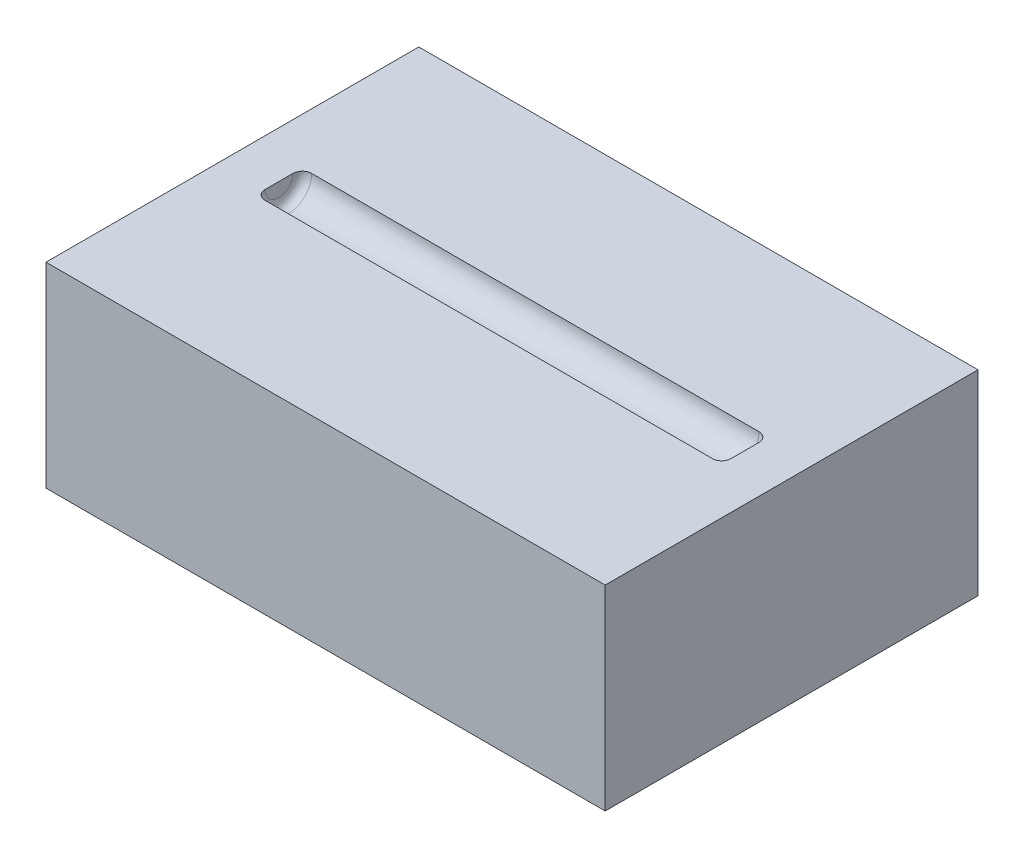
ISO-10303-21;
HEADER;
FILE_DESCRIPTION(('STEP AP214'),'2;1');
FILE_NAME('part.step','',(''),(''),'','','');
FILE_SCHEMA(('AUTOMOTIVE_DESIGN { 1 0 10303 214 1 1 1 1 }'));
ENDSEC;
DATA;
#1=APPLICATION_CONTEXT('core data for automotive mechanical design processes');
#2=APPLICATION_PROTOCOL_DEFINITION('international standard','automotive_design',2000,#1);
#3=PRODUCT_CONTEXT('',#1,'mechanical');
#4=PRODUCT('Part','Part','',(#3));
#5=PRODUCT_RELATED_PRODUCT_CATEGORY('part','',(#4));
#6=PRODUCT_DEFINITION_FORMATION('','',#4);
#7=PRODUCT_DEFINITION_CONTEXT('part definition',#1,'design');
#8=PRODUCT_DEFINITION('design','',#6,#7);
#9=PRODUCT_DEFINITION_SHAPE('','',#8);
#10=(LENGTH_UNIT() NAMED_UNIT(*) SI_UNIT(.MILLI.,.METRE.));
#11=(NAMED_UNIT(*) PLANE_ANGLE_UNIT() SI_UNIT($,.RADIAN.));
#12=(NAMED_UNIT(*) SI_UNIT($,.STERADIAN.) SOLID_ANGLE_UNIT());
#13=UNCERTAINTY_MEASURE_WITH_UNIT(LENGTH_MEASURE(1.E-05),#10,'distance_accuracy_value','');
#14=(GEOMETRIC_REPRESENTATION_CONTEXT(3) GLOBAL_UNCERTAINTY_ASSIGNED_CONTEXT((#13)) GLOBAL_UNIT_ASSIGNED_CONTEXT((#10,
#11,#12)) REPRESENTATION_CONTEXT('',''));
#15=CARTESIAN_POINT('',(0.,0.,0.));
#16=DIRECTION('',(0.,0.,1.));
#17=DIRECTION('',(1.,0.,0.));
#18=AXIS2_PLACEMENT_3D('',#15,#16,#17);
#19=CARTESIAN_POINT('',(76.2,-53.34,50.8));
#20=DIRECTION('',(1.,0.,0.));
#21=DIRECTION('',(0.,0.,-1.));
#22=AXIS2_PLACEMENT_3D('',#19,#20,#21);
#23=PLANE('',#22);
#24=DIRECTION('',(0.,0.,-1.));
#25=VECTOR('',#24,1.);
#26=CARTESIAN_POINT('',(76.2,0.,50.8));
#27=LINE('',#26,#25);
#28=CARTESIAN_POINT('',(76.2,0.,50.8));
#29=VERTEX_POINT('',#28);
#30=CARTESIAN_POINT('',(76.2,0.,-50.8));
#31=VERTEX_POINT('',#30);
#32=EDGE_CURVE('E132',#29,#31,#27,.T.);
#33=ORIENTED_EDGE('',*,*,#32,.F.);
#34=DIRECTION('',(0.,1.,0.));
#35=VECTOR('',#34,1.);
#36=CARTESIAN_POINT('',(76.2,-53.34,50.8));
#37=LINE('',#36,#35);
#38=CARTESIAN_POINT('',(76.2,-53.34,50.8));
#39=VERTEX_POINT('',#38);
#40=EDGE_CURVE('E123',#39,#29,#37,.T.);
#41=ORIENTED_EDGE('',*,*,#40,.F.);
#42=DIRECTION('',(0.,0.,-1.));
#43=VECTOR('',#42,1.);
#44=CARTESIAN_POINT('',(76.2,-53.34,50.8));
#45=LINE('',#44,#43);
#46=CARTESIAN_POINT('',(76.2,-53.34,-50.8));
#47=VERTEX_POINT('',#46);
#48=EDGE_CURVE('E118',#39,#47,#45,.T.);
#49=ORIENTED_EDGE('',*,*,#48,.T.);
#50=DIRECTION('',(0.,1.,0.));
#51=VECTOR('',#50,1.);
#52=CARTESIAN_POINT('',(76.2,-53.34,-50.8));
#53=LINE('',#52,#51);
#54=EDGE_CURVE('E100',#47,#31,#53,.T.);
#55=ORIENTED_EDGE('',*,*,#54,.T.);
#56=EDGE_LOOP('',(#33,#41,#49,#55));
#57=FACE_BOUND('',#56,.T.);
#58=ADVANCED_FACE('F35',(#57),#23,.T.);
#59=CARTESIAN_POINT('',(-76.2,-53.34,50.8));
#60=DIRECTION('',(0.,0.,1.));
#61=DIRECTION('',(1.,0.,0.));
#62=AXIS2_PLACEMENT_3D('',#59,#60,#61);
#63=PLANE('',#62);
#64=DIRECTION('',(1.,0.,0.));
#65=VECTOR('',#64,1.);
#66=CARTESIAN_POINT('',(-76.2,0.,50.8));
#67=LINE('',#66,#65);
#68=CARTESIAN_POINT('',(-76.2,0.,50.8));
#69=VERTEX_POINT('',#68);
#70=EDGE_CURVE('E124',#69,#29,#67,.T.);
#71=ORIENTED_EDGE('',*,*,#70,.F.);
#72=DIRECTION('',(0.,1.,0.));
#73=VECTOR('',#72,1.);
#74=CARTESIAN_POINT('',(-76.2,-53.34,50.8));
#75=LINE('',#74,#73);
#76=CARTESIAN_POINT('',(-76.2,-53.34,50.8));
#77=VERTEX_POINT('',#76);
#78=EDGE_CURVE('E139',#77,#69,#75,.T.);
#79=ORIENTED_EDGE('',*,*,#78,.F.);
#80=DIRECTION('',(1.,0.,0.));
#81=VECTOR('',#80,1.);
#82=CARTESIAN_POINT('',(-76.2,-53.34,50.8));
#83=LINE('',#82,#81);
#84=EDGE_CURVE('E111',#77,#39,#83,.T.);
#85=ORIENTED_EDGE('',*,*,#84,.T.);
#86=ORIENTED_EDGE('',*,*,#40,.T.);
#87=EDGE_LOOP('',(#71,#79,#85,#86));
#88=FACE_BOUND('',#87,.T.);
#89=ADVANCED_FACE('F185',(#88),#63,.T.);
#90=CARTESIAN_POINT('',(-76.2,-53.34,50.8));
#91=DIRECTION('',(-1.,0.,0.));
#92=DIRECTION('',(0.,0.,1.));
#93=AXIS2_PLACEMENT_3D('',#90,#91,#92);
#94=PLANE('',#93);
#95=DIRECTION('',(0.,0.,1.));
#96=VECTOR('',#95,1.);
#97=CARTESIAN_POINT('',(-76.2,0.,50.8));
#98=LINE('',#97,#96);
#99=CARTESIAN_POINT('',(-76.2,0.,-50.8));
#100=VERTEX_POINT('',#99);
#101=EDGE_CURVE('E127',#100,#69,#98,.T.);
#102=ORIENTED_EDGE('',*,*,#101,.F.);
#103=DIRECTION('',(0.,1.,0.));
#104=VECTOR('',#103,1.);
#105=CARTESIAN_POINT('',(-76.2,-53.34,-50.8));
#106=LINE('',#105,#104);
#107=CARTESIAN_POINT('',(-76.2,-53.34,-50.8));
#108=VERTEX_POINT('',#107);
#109=EDGE_CURVE('E110',#108,#100,#106,.T.);
#110=ORIENTED_EDGE('',*,*,#109,.F.);
#111=DIRECTION('',(0.,0.,1.));
#112=VECTOR('',#111,1.);
#113=CARTESIAN_POINT('',(-76.2,-53.34,50.8));
#114=LINE('',#113,#112);
#115=EDGE_CURVE('E121',#108,#77,#114,.T.);
#116=ORIENTED_EDGE('',*,*,#115,.T.);
#117=ORIENTED_EDGE('',*,*,#78,.T.);
#118=EDGE_LOOP('',(#102,#110,#116,#117));
#119=FACE_BOUND('',#118,.T.);
#120=ADVANCED_FACE('F190',(#119),#94,.T.);
#121=CARTESIAN_POINT('',(-76.2,-53.34,-50.8));
#122=DIRECTION('',(0.,0.,-1.));
#123=DIRECTION('',(-1.,0.,0.));
#124=AXIS2_PLACEMENT_3D('',#121,#122,#123);
#125=PLANE('',#124);
#126=DIRECTION('',(-1.,0.,0.));
#127=VECTOR('',#126,1.);
#128=CARTESIAN_POINT('',(-76.2,0.,-50.8));
#129=LINE('',#128,#127);
#130=EDGE_CURVE('E105',#31,#100,#129,.T.);
#131=ORIENTED_EDGE('',*,*,#130,.F.);
#132=ORIENTED_EDGE('',*,*,#54,.F.);
#133=DIRECTION('',(-1.,0.,0.));
#134=VECTOR('',#133,1.);
#135=CARTESIAN_POINT('',(-76.2,-53.34,-50.8));
#136=LINE('',#135,#134);
#137=EDGE_CURVE('E103',#47,#108,#136,.T.);
#138=ORIENTED_EDGE('',*,*,#137,.T.);
#139=ORIENTED_EDGE('',*,*,#109,.T.);
#140=EDGE_LOOP('',(#131,#132,#138,#139));
#141=FACE_BOUND('',#140,.T.);
#142=ADVANCED_FACE('F102',(#141),#125,.T.);
#143=CARTESIAN_POINT('',(0.,-53.34,0.));
#144=DIRECTION('',(0.,-1.,0.));
#145=DIRECTION('',(0.,0.,-1.));
#146=AXIS2_PLACEMENT_3D('',#143,#144,#145);
#147=PLANE('',#146);
#148=ORIENTED_EDGE('',*,*,#48,.F.);
#149=ORIENTED_EDGE('',*,*,#84,.F.);
#150=ORIENTED_EDGE('',*,*,#115,.F.);
#151=ORIENTED_EDGE('',*,*,#137,.F.);
#152=EDGE_LOOP('',(#148,#149,#150,#151));
#153=FACE_BOUND('',#152,.T.);
#154=ADVANCED_FACE('F116',(#153),#147,.T.);
#155=CARTESIAN_POINT('',(0.,0.,0.));
#156=DIRECTION('',(0.,-1.,0.));
#157=DIRECTION('',(0.,0.,-1.));
#158=AXIS2_PLACEMENT_3D('',#155,#156,#157);
#159=PLANE('',#158);
#160=DIRECTION('',(1.,0.,0.));
#161=VECTOR('',#160,1.);
#162=CARTESIAN_POINT('',(-94.1605122421383,0.,6.35));
#163=LINE('',#162,#161);
#164=CARTESIAN_POINT('',(60.96,0.,6.35));
#165=VERTEX_POINT('',#164);
#166=CARTESIAN_POINT('',(-60.96,0.,6.35));
#167=VERTEX_POINT('',#166);
#168=EDGE_CURVE('E138',#165,#167,#163,.F.);
#169=ORIENTED_EDGE('',*,*,#168,.T.);
#170=CARTESIAN_POINT('',(-60.96,0.,3.81));
#171=DIRECTION('',(0.,-1.,0.));
#172=DIRECTION('',(0.,0.,-1.));
#173=AXIS2_PLACEMENT_3D('',#170,#171,#172);
#174=CIRCLE('',#173,2.54);
#175=CARTESIAN_POINT('',(-63.5,0.,3.81));
#176=VERTEX_POINT('',#175);
#177=EDGE_CURVE('E12',#167,#176,#174,.T.);
#178=ORIENTED_EDGE('',*,*,#177,.T.);
#179=DIRECTION('',(0.,0.,-1.));
#180=VECTOR('',#179,1.);
#181=CARTESIAN_POINT('',(-63.5,0.,0.));
#182=LINE('',#181,#180);
#183=CARTESIAN_POINT('',(-63.5,0.,-3.81));
#184=VERTEX_POINT('',#183);
#185=EDGE_CURVE('E146',#176,#184,#182,.T.);
#186=ORIENTED_EDGE('',*,*,#185,.T.);
#187=CARTESIAN_POINT('',(-60.96,0.,-3.81));
#188=DIRECTION('',(0.,-1.,0.));
#189=DIRECTION('',(0.,0.,-1.));
#190=AXIS2_PLACEMENT_3D('',#187,#188,#189);
#191=CIRCLE('',#190,2.54);
#192=CARTESIAN_POINT('',(-60.96,0.,-6.35));
#193=VERTEX_POINT('',#192);
#194=EDGE_CURVE('E43',#184,#193,#191,.T.);
#195=ORIENTED_EDGE('',*,*,#194,.T.);
#196=DIRECTION('',(1.,0.,0.));
#197=VECTOR('',#196,1.);
#198=CARTESIAN_POINT('',(-94.1605122421383,0.,-6.35));
#199=LINE('',#198,#197);
#200=CARTESIAN_POINT('',(60.96,0.,-6.35));
#201=VERTEX_POINT('',#200);
#202=EDGE_CURVE('E148',#193,#201,#199,.T.);
#203=ORIENTED_EDGE('',*,*,#202,.T.);
#204=CARTESIAN_POINT('',(60.96,0.,-3.81));
#205=DIRECTION('',(0.,-1.,0.));
#206=DIRECTION('',(0.,0.,-1.));
#207=AXIS2_PLACEMENT_3D('',#204,#205,#206);
#208=CIRCLE('',#207,2.54);
#209=CARTESIAN_POINT('',(63.5,0.,-3.81));
#210=VERTEX_POINT('',#209);
#211=EDGE_CURVE('E160',#201,#210,#208,.T.);
#212=ORIENTED_EDGE('',*,*,#211,.T.);
#213=DIRECTION('',(0.,0.,1.));
#214=VECTOR('',#213,1.);
#215=CARTESIAN_POINT('',(63.5,0.,0.));
#216=LINE('',#215,#214);
#217=CARTESIAN_POINT('',(63.5,0.,3.81));
#218=VERTEX_POINT('',#217);
#219=EDGE_CURVE('E143',#210,#218,#216,.T.);
#220=ORIENTED_EDGE('',*,*,#219,.T.);
#221=CARTESIAN_POINT('',(60.96,0.,3.81));
#222=DIRECTION('',(0.,-1.,0.));
#223=DIRECTION('',(0.,0.,-1.));
#224=AXIS2_PLACEMENT_3D('',#221,#222,#223);
#225=CIRCLE('',#224,2.54);
#226=EDGE_CURVE('E162',#218,#165,#225,.T.);
#227=ORIENTED_EDGE('',*,*,#226,.T.);
#228=EDGE_LOOP('',(#169,#178,#186,#195,#203,#212,#220,#227));
#229=FACE_BOUND('',#228,.T.);
#230=ORIENTED_EDGE('',*,*,#32,.T.);
#231=ORIENTED_EDGE('',*,*,#130,.T.);
#232=ORIENTED_EDGE('',*,*,#101,.T.);
#233=ORIENTED_EDGE('',*,*,#70,.T.);
#234=EDGE_LOOP('',(#230,#231,#232,#233));
#235=FACE_BOUND('',#234,.T.);
#236=ADVANCED_FACE('F164',(#229,#235),#159,.F.);
#237=CARTESIAN_POINT('',(-63.5,-53.34,50.8));
#238=DIRECTION('',(-1.,0.,0.));
#239=DIRECTION('',(0.,0.,1.));
#240=AXIS2_PLACEMENT_3D('',#237,#238,#239);
#241=PLANE('',#240);
#242=ORIENTED_EDGE('',*,*,#185,.F.);
#243=CARTESIAN_POINT('',(-63.5,0.,0.));
#244=DIRECTION('',(-1.,0.,0.));
#245=DIRECTION('',(0.,0.,1.));
#246=AXIS2_PLACEMENT_3D('',#243,#244,#245);
#247=CIRCLE('',#246,3.81);
#248=EDGE_CURVE('E158',#176,#184,#247,.F.);
#249=ORIENTED_EDGE('',*,*,#248,.T.);
#250=EDGE_LOOP('',(#242,#249));
#251=FACE_BOUND('',#250,.T.);
#252=ADVANCED_FACE('F171',(#251),#241,.F.);
#253=CARTESIAN_POINT('',(63.5,0.,0.));
#254=DIRECTION('',(1.,0.,0.));
#255=DIRECTION('',(0.,0.,-1.));
#256=AXIS2_PLACEMENT_3D('',#253,#254,#255);
#257=PLANE('',#256);
#258=ORIENTED_EDGE('',*,*,#219,.F.);
#259=CARTESIAN_POINT('',(63.5,0.,0.));
#260=DIRECTION('',(1.,0.,0.));
#261=DIRECTION('',(0.,0.,-1.));
#262=AXIS2_PLACEMENT_3D('',#259,#260,#261);
#263=CIRCLE('',#262,3.81);
#264=EDGE_CURVE('E156',#210,#218,#263,.F.);
#265=ORIENTED_EDGE('',*,*,#264,.T.);
#266=EDGE_LOOP('',(#258,#265));
#267=FACE_BOUND('',#266,.T.);
#268=ADVANCED_FACE('F173',(#267),#257,.F.);
#269=CARTESIAN_POINT('',(-94.1605122421383,0.,0.));
#270=DIRECTION('',(1.,0.,0.));
#271=DIRECTION('',(0.,0.,-1.));
#272=AXIS2_PLACEMENT_3D('',#269,#270,#271);
#273=CYLINDRICAL_SURFACE('',#272,6.35);
#274=ORIENTED_EDGE('',*,*,#168,.F.);
#275=CARTESIAN_POINT('',(60.96,0.,0.));
#276=DIRECTION('',(1.,0.,0.));
#277=DIRECTION('',(0.,0.,-1.));
#278=AXIS2_PLACEMENT_3D('',#275,#276,#277);
#279=CIRCLE('',#278,6.35);
#280=EDGE_CURVE('E153',#165,#201,#279,.T.);
#281=ORIENTED_EDGE('',*,*,#280,.T.);
#282=ORIENTED_EDGE('',*,*,#202,.F.);
#283=CARTESIAN_POINT('',(-60.96,0.,0.));
#284=DIRECTION('',(-1.,0.,0.));
#285=DIRECTION('',(0.,0.,1.));
#286=AXIS2_PLACEMENT_3D('',#283,#284,#285);
#287=CIRCLE('',#286,6.35);
#288=EDGE_CURVE('E151',#193,#167,#287,.T.);
#289=ORIENTED_EDGE('',*,*,#288,.T.);
#290=EDGE_LOOP('',(#274,#281,#282,#289));
#291=FACE_BOUND('',#290,.T.);
#292=ADVANCED_FACE('F168',(#291),#273,.F.);
#293=CARTESIAN_POINT('',(60.96,0.,0.));
#294=DIRECTION('',(1.,0.,0.));
#295=DIRECTION('',(0.,0.,-1.));
#296=AXIS2_PLACEMENT_3D('',#293,#294,#295);
#297=TOROIDAL_SURFACE('',#296,3.81,2.54);
#298=ORIENTED_EDGE('',*,*,#226,.F.);
#299=ORIENTED_EDGE('',*,*,#264,.F.);
#300=ORIENTED_EDGE('',*,*,#211,.F.);
#301=ORIENTED_EDGE('',*,*,#280,.F.);
#302=EDGE_LOOP('',(#298,#299,#300,#301));
#303=FACE_BOUND('',#302,.T.);
#304=ADVANCED_FACE('F195',(#303),#297,.F.);
#305=CARTESIAN_POINT('',(-60.96,0.,0.));
#306=DIRECTION('',(-1.,0.,0.));
#307=DIRECTION('',(0.,0.,1.));
#308=AXIS2_PLACEMENT_3D('',#305,#306,#307);
#309=TOROIDAL_SURFACE('',#308,3.81,2.54);
#310=ORIENTED_EDGE('',*,*,#177,.F.);
#311=ORIENTED_EDGE('',*,*,#288,.F.);
#312=ORIENTED_EDGE('',*,*,#194,.F.);
#313=ORIENTED_EDGE('',*,*,#248,.F.);
#314=EDGE_LOOP('',(#310,#311,#312,#313));
#315=FACE_BOUND('',#314,.T.);
#316=ADVANCED_FACE('F37',(#315),#309,.F.);
#317=CLOSED_SHELL('',(#58,#89,#120,#142,#154,#236,#252,#268,#292,#304,#316));
#318=MANIFOLD_SOLID_BREP('B2',#317);
#319=ADVANCED_BREP_SHAPE_REPRESENTATION('',(#18,#318),#14);
#320=SHAPE_DEFINITION_REPRESENTATION(#9,#319);
ENDSEC;
END-ISO-10303-21;
